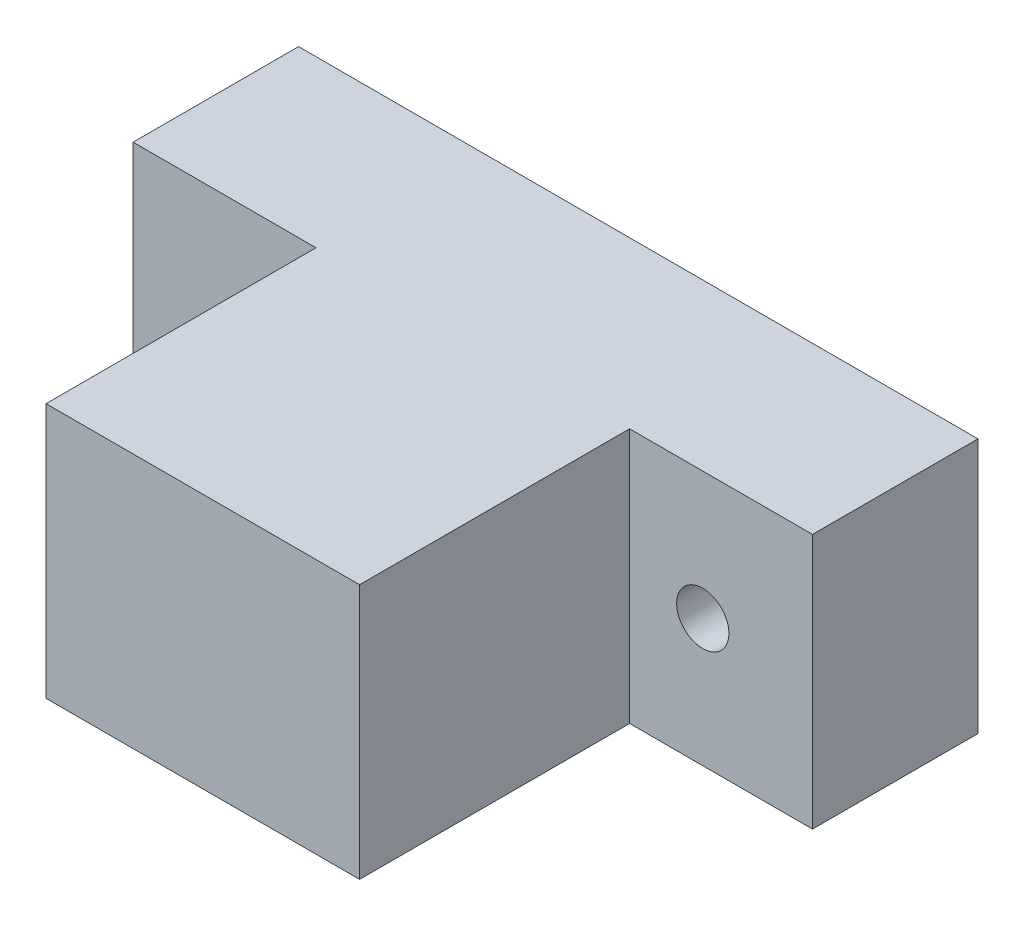
ISO-10303-21;
HEADER;
FILE_DESCRIPTION(('STEP AP214'),'2;1');
FILE_NAME('part.step','',(''),(''),'','','');
FILE_SCHEMA(('AUTOMOTIVE_DESIGN { 1 0 10303 214 1 1 1 1 }'));
ENDSEC;
DATA;
#1=APPLICATION_CONTEXT('core data for automotive mechanical design processes');
#2=APPLICATION_PROTOCOL_DEFINITION('international standard','automotive_design',2000,#1);
#3=PRODUCT_CONTEXT('',#1,'mechanical');
#4=PRODUCT('Part','Part','',(#3));
#5=PRODUCT_RELATED_PRODUCT_CATEGORY('part','',(#4));
#6=PRODUCT_DEFINITION_FORMATION('','',#4);
#7=PRODUCT_DEFINITION_CONTEXT('part definition',#1,'design');
#8=PRODUCT_DEFINITION('design','',#6,#7);
#9=PRODUCT_DEFINITION_SHAPE('','',#8);
#10=(LENGTH_UNIT() NAMED_UNIT(*) SI_UNIT(.MILLI.,.METRE.));
#11=(NAMED_UNIT(*) PLANE_ANGLE_UNIT() SI_UNIT($,.RADIAN.));
#12=(NAMED_UNIT(*) SI_UNIT($,.STERADIAN.) SOLID_ANGLE_UNIT());
#13=UNCERTAINTY_MEASURE_WITH_UNIT(LENGTH_MEASURE(1.E-05),#10,'distance_accuracy_value','');
#14=(GEOMETRIC_REPRESENTATION_CONTEXT(3) GLOBAL_UNCERTAINTY_ASSIGNED_CONTEXT((#13)) GLOBAL_UNIT_ASSIGNED_CONTEXT((#10,
#11,#12)) REPRESENTATION_CONTEXT('',''));
#15=CARTESIAN_POINT('',(0.,0.,0.));
#16=DIRECTION('',(0.,0.,1.));
#17=DIRECTION('',(1.,0.,0.));
#18=AXIS2_PLACEMENT_3D('',#15,#16,#17);
#19=CARTESIAN_POINT('',(0.,0.,9.5));
#20=DIRECTION('',(0.,0.,-1.));
#21=DIRECTION('',(-1.,0.,0.));
#22=AXIS2_PLACEMENT_3D('',#19,#20,#21);
#23=PLANE('',#22);
#24=CARTESIAN_POINT('',(6.3,7.325,9.5));
#25=DIRECTION('',(0.,0.,-1.));
#26=DIRECTION('',(-1.,0.,0.));
#27=AXIS2_PLACEMENT_3D('',#24,#25,#26);
#28=CIRCLE('',#27,1.5);
#29=CARTESIAN_POINT('',(4.8,7.325,9.5));
#30=VERTEX_POINT('',#29);
#31=EDGE_CURVE('E178',#30,#30,#28,.T.);
#32=ORIENTED_EDGE('',*,*,#31,.T.);
#33=EDGE_LOOP('',(#32));
#34=FACE_BOUND('',#33,.T.);
#35=DIRECTION('',(0.,-1.,0.));
#36=VECTOR('',#35,1.);
#37=CARTESIAN_POINT('',(10.5,14.65,9.5));
#38=LINE('',#37,#36);
#39=CARTESIAN_POINT('',(10.5,14.65,9.5));
#40=VERTEX_POINT('',#39);
#41=CARTESIAN_POINT('',(10.5,0.,9.5));
#42=VERTEX_POINT('',#41);
#43=EDGE_CURVE('E48',#40,#42,#38,.T.);
#44=ORIENTED_EDGE('',*,*,#43,.F.);
#45=DIRECTION('',(-1.,0.,0.));
#46=VECTOR('',#45,1.);
#47=CARTESIAN_POINT('',(0.,14.65,9.5));
#48=LINE('',#47,#46);
#49=CARTESIAN_POINT('',(0.,14.65,9.5));
#50=VERTEX_POINT('',#49);
#51=EDGE_CURVE('E137',#40,#50,#48,.T.);
#52=ORIENTED_EDGE('',*,*,#51,.T.);
#53=DIRECTION('',(0.,-1.,0.));
#54=VECTOR('',#53,1.);
#55=CARTESIAN_POINT('',(0.,0.,9.5));
#56=LINE('',#55,#54);
#57=CARTESIAN_POINT('',(0.,0.,9.5));
#58=VERTEX_POINT('',#57);
#59=EDGE_CURVE('E128',#50,#58,#56,.T.);
#60=ORIENTED_EDGE('',*,*,#59,.T.);
#61=DIRECTION('',(1.,0.,0.));
#62=VECTOR('',#61,1.);
#63=CARTESIAN_POINT('',(0.,0.,9.5));
#64=LINE('',#63,#62);
#65=EDGE_CURVE('E133',#58,#42,#64,.T.);
#66=ORIENTED_EDGE('',*,*,#65,.T.);
#67=EDGE_LOOP('',(#44,#52,#60,#66));
#68=FACE_BOUND('',#67,.T.);
#69=ADVANCED_FACE('F33',(#34,#68),#23,.F.);
#70=CARTESIAN_POINT('',(32.7,7.325,9.5));
#71=DIRECTION('',(0.,0.,-1.));
#72=DIRECTION('',(-1.,0.,0.));
#73=AXIS2_PLACEMENT_3D('',#70,#71,#72);
#74=CIRCLE('',#73,1.5);
#75=CARTESIAN_POINT('',(31.2,7.325,9.5));
#76=VERTEX_POINT('',#75);
#77=EDGE_CURVE('E173',#76,#76,#74,.T.);
#78=ORIENTED_EDGE('',*,*,#77,.T.);
#79=EDGE_LOOP('',(#78));
#80=FACE_BOUND('',#79,.T.);
#81=DIRECTION('',(0.,1.,0.));
#82=VECTOR('',#81,1.);
#83=CARTESIAN_POINT('',(28.5,14.65,9.5));
#84=LINE('',#83,#82);
#85=CARTESIAN_POINT('',(28.5,0.,9.5));
#86=VERTEX_POINT('',#85);
#87=CARTESIAN_POINT('',(28.5,14.65,9.5));
#88=VERTEX_POINT('',#87);
#89=EDGE_CURVE('E56',#86,#88,#84,.T.);
#90=ORIENTED_EDGE('',*,*,#89,.F.);
#91=CARTESIAN_POINT('',(39.,0.,9.5));
#92=VERTEX_POINT('',#91);
#93=EDGE_CURVE('E131',#86,#92,#64,.T.);
#94=ORIENTED_EDGE('',*,*,#93,.T.);
#95=DIRECTION('',(0.,1.,0.));
#96=VECTOR('',#95,1.);
#97=CARTESIAN_POINT('',(39.,0.,9.5));
#98=LINE('',#97,#96);
#99=CARTESIAN_POINT('',(39.,14.65,9.5));
#100=VERTEX_POINT('',#99);
#101=EDGE_CURVE('E135',#92,#100,#98,.T.);
#102=ORIENTED_EDGE('',*,*,#101,.T.);
#103=EDGE_CURVE('E138',#100,#88,#48,.T.);
#104=ORIENTED_EDGE('',*,*,#103,.T.);
#105=EDGE_LOOP('',(#90,#94,#102,#104));
#106=FACE_BOUND('',#105,.T.);
#107=ADVANCED_FACE('F203',(#80,#106),#23,.F.);
#108=CARTESIAN_POINT('',(0.,0.,9.5));
#109=DIRECTION('',(1.,0.,0.));
#110=DIRECTION('',(0.,0.,-1.));
#111=AXIS2_PLACEMENT_3D('',#108,#109,#110);
#112=PLANE('',#111);
#113=DIRECTION('',(0.,-1.,0.));
#114=VECTOR('',#113,1.);
#115=CARTESIAN_POINT('',(0.,0.,0.));
#116=LINE('',#115,#114);
#117=CARTESIAN_POINT('',(0.,14.65,0.));
#118=VERTEX_POINT('',#117);
#119=CARTESIAN_POINT('',(0.,0.,0.));
#120=VERTEX_POINT('',#119);
#121=EDGE_CURVE('E119',#118,#120,#116,.T.);
#122=ORIENTED_EDGE('',*,*,#121,.T.);
#123=DIRECTION('',(0.,0.,-1.));
#124=VECTOR('',#123,1.);
#125=CARTESIAN_POINT('',(0.,0.,9.5));
#126=LINE('',#125,#124);
#127=EDGE_CURVE('E11',#58,#120,#126,.T.);
#128=ORIENTED_EDGE('',*,*,#127,.F.);
#129=ORIENTED_EDGE('',*,*,#59,.F.);
#130=DIRECTION('',(0.,0.,-1.));
#131=VECTOR('',#130,1.);
#132=CARTESIAN_POINT('',(0.,14.65,9.5));
#133=LINE('',#132,#131);
#134=EDGE_CURVE('E139',#50,#118,#133,.T.);
#135=ORIENTED_EDGE('',*,*,#134,.T.);
#136=EDGE_LOOP('',(#122,#128,#129,#135));
#137=FACE_BOUND('',#136,.T.);
#138=ADVANCED_FACE('F35',(#137),#112,.F.);
#139=CARTESIAN_POINT('',(0.,0.,9.5));
#140=DIRECTION('',(0.,1.,0.));
#141=DIRECTION('',(0.,0.,1.));
#142=AXIS2_PLACEMENT_3D('',#139,#140,#141);
#143=PLANE('',#142);
#144=DIRECTION('',(1.,0.,0.));
#145=VECTOR('',#144,1.);
#146=CARTESIAN_POINT('',(0.,0.,0.));
#147=LINE('',#146,#145);
#148=CARTESIAN_POINT('',(39.,0.,0.));
#149=VERTEX_POINT('',#148);
#150=EDGE_CURVE('E122',#120,#149,#147,.T.);
#151=ORIENTED_EDGE('',*,*,#150,.T.);
#152=DIRECTION('',(0.,0.,-1.));
#153=VECTOR('',#152,1.);
#154=CARTESIAN_POINT('',(39.,0.,9.5));
#155=LINE('',#154,#153);
#156=EDGE_CURVE('E41',#92,#149,#155,.T.);
#157=ORIENTED_EDGE('',*,*,#156,.F.);
#158=ORIENTED_EDGE('',*,*,#93,.F.);
#159=DIRECTION('',(0.,0.,-1.));
#160=VECTOR('',#159,1.);
#161=CARTESIAN_POINT('',(28.5,0.,25.));
#162=LINE('',#161,#160);
#163=CARTESIAN_POINT('',(28.5,0.,25.));
#164=VERTEX_POINT('',#163);
#165=EDGE_CURVE('E104',#164,#86,#162,.T.);
#166=ORIENTED_EDGE('',*,*,#165,.F.);
#167=DIRECTION('',(1.,0.,0.));
#168=VECTOR('',#167,1.);
#169=CARTESIAN_POINT('',(10.5,0.,25.));
#170=LINE('',#169,#168);
#171=CARTESIAN_POINT('',(10.5,0.,25.));
#172=VERTEX_POINT('',#171);
#173=EDGE_CURVE('E98',#172,#164,#170,.T.);
#174=ORIENTED_EDGE('',*,*,#173,.F.);
#175=DIRECTION('',(0.,0.,-1.));
#176=VECTOR('',#175,1.);
#177=CARTESIAN_POINT('',(10.5,0.,25.));
#178=LINE('',#177,#176);
#179=EDGE_CURVE('E102',#172,#42,#178,.T.);
#180=ORIENTED_EDGE('',*,*,#179,.T.);
#181=ORIENTED_EDGE('',*,*,#65,.F.);
#182=ORIENTED_EDGE('',*,*,#127,.T.);
#183=EDGE_LOOP('',(#151,#157,#158,#166,#174,#180,#181,#182));
#184=FACE_BOUND('',#183,.T.);
#185=ADVANCED_FACE('F100',(#184),#143,.F.);
#186=CARTESIAN_POINT('',(39.,0.,9.5));
#187=DIRECTION('',(-1.,0.,0.));
#188=DIRECTION('',(0.,0.,1.));
#189=AXIS2_PLACEMENT_3D('',#186,#187,#188);
#190=PLANE('',#189);
#191=DIRECTION('',(0.,1.,0.));
#192=VECTOR('',#191,1.);
#193=CARTESIAN_POINT('',(39.,0.,0.));
#194=LINE('',#193,#192);
#195=CARTESIAN_POINT('',(39.,14.65,0.));
#196=VERTEX_POINT('',#195);
#197=EDGE_CURVE('E142',#149,#196,#194,.T.);
#198=ORIENTED_EDGE('',*,*,#197,.T.);
#199=DIRECTION('',(0.,0.,-1.));
#200=VECTOR('',#199,1.);
#201=CARTESIAN_POINT('',(39.,14.65,9.5));
#202=LINE('',#201,#200);
#203=EDGE_CURVE('E147',#100,#196,#202,.T.);
#204=ORIENTED_EDGE('',*,*,#203,.F.);
#205=ORIENTED_EDGE('',*,*,#101,.F.);
#206=ORIENTED_EDGE('',*,*,#156,.T.);
#207=EDGE_LOOP('',(#198,#204,#205,#206));
#208=FACE_BOUND('',#207,.T.);
#209=ADVANCED_FACE('F154',(#208),#190,.F.);
#210=CARTESIAN_POINT('',(0.,14.65,9.5));
#211=DIRECTION('',(0.,-1.,0.));
#212=DIRECTION('',(0.,0.,-1.));
#213=AXIS2_PLACEMENT_3D('',#210,#211,#212);
#214=PLANE('',#213);
#215=DIRECTION('',(-1.,0.,0.));
#216=VECTOR('',#215,1.);
#217=CARTESIAN_POINT('',(0.,14.65,0.));
#218=LINE('',#217,#216);
#219=EDGE_CURVE('E132',#196,#118,#218,.T.);
#220=ORIENTED_EDGE('',*,*,#219,.T.);
#221=ORIENTED_EDGE('',*,*,#134,.F.);
#222=ORIENTED_EDGE('',*,*,#51,.F.);
#223=DIRECTION('',(0.,0.,-1.));
#224=VECTOR('',#223,1.);
#225=CARTESIAN_POINT('',(10.5,14.65,25.));
#226=LINE('',#225,#224);
#227=CARTESIAN_POINT('',(10.5,14.65,25.));
#228=VERTEX_POINT('',#227);
#229=EDGE_CURVE('E167',#228,#40,#226,.T.);
#230=ORIENTED_EDGE('',*,*,#229,.F.);
#231=DIRECTION('',(-1.,0.,0.));
#232=VECTOR('',#231,1.);
#233=CARTESIAN_POINT('',(10.5,14.65,25.));
#234=LINE('',#233,#232);
#235=CARTESIAN_POINT('',(28.5,14.65,25.));
#236=VERTEX_POINT('',#235);
#237=EDGE_CURVE('E113',#236,#228,#234,.T.);
#238=ORIENTED_EDGE('',*,*,#237,.F.);
#239=DIRECTION('',(0.,0.,-1.));
#240=VECTOR('',#239,1.);
#241=CARTESIAN_POINT('',(28.5,14.65,25.));
#242=LINE('',#241,#240);
#243=EDGE_CURVE('E124',#236,#88,#242,.T.);
#244=ORIENTED_EDGE('',*,*,#243,.T.);
#245=ORIENTED_EDGE('',*,*,#103,.F.);
#246=ORIENTED_EDGE('',*,*,#203,.T.);
#247=EDGE_LOOP('',(#220,#221,#222,#230,#238,#244,#245,#246));
#248=FACE_BOUND('',#247,.T.);
#249=ADVANCED_FACE('F162',(#248),#214,.F.);
#250=CARTESIAN_POINT('',(0.,0.,0.));
#251=DIRECTION('',(0.,0.,-1.));
#252=DIRECTION('',(-1.,0.,0.));
#253=AXIS2_PLACEMENT_3D('',#250,#251,#252);
#254=PLANE('',#253);
#255=CARTESIAN_POINT('',(32.7,7.325,0.));
#256=DIRECTION('',(0.,0.,-1.));
#257=DIRECTION('',(-1.,0.,0.));
#258=AXIS2_PLACEMENT_3D('',#255,#256,#257);
#259=CIRCLE('',#258,1.5);
#260=CARTESIAN_POINT('',(31.2,7.325,0.));
#261=VERTEX_POINT('',#260);
#262=EDGE_CURVE('E181',#261,#261,#259,.T.);
#263=ORIENTED_EDGE('',*,*,#262,.F.);
#264=EDGE_LOOP('',(#263));
#265=FACE_BOUND('',#264,.T.);
#266=CARTESIAN_POINT('',(6.3,7.325,0.));
#267=DIRECTION('',(0.,0.,-1.));
#268=DIRECTION('',(1.,0.,0.));
#269=AXIS2_PLACEMENT_3D('',#266,#267,#268);
#270=CIRCLE('',#269,1.5);
#271=CARTESIAN_POINT('',(7.8,7.325,0.));
#272=VERTEX_POINT('',#271);
#273=EDGE_CURVE('E182',#272,#272,#270,.T.);
#274=ORIENTED_EDGE('',*,*,#273,.F.);
#275=EDGE_LOOP('',(#274));
#276=FACE_BOUND('',#275,.T.);
#277=ORIENTED_EDGE('',*,*,#121,.F.);
#278=ORIENTED_EDGE('',*,*,#219,.F.);
#279=ORIENTED_EDGE('',*,*,#197,.F.);
#280=ORIENTED_EDGE('',*,*,#150,.F.);
#281=EDGE_LOOP('',(#277,#278,#279,#280));
#282=FACE_BOUND('',#281,.T.);
#283=ADVANCED_FACE('F159',(#265,#276,#282),#254,.T.);
#284=CARTESIAN_POINT('',(10.5,14.65,25.));
#285=DIRECTION('',(1.,0.,0.));
#286=DIRECTION('',(0.,0.,-1.));
#287=AXIS2_PLACEMENT_3D('',#284,#285,#286);
#288=PLANE('',#287);
#289=ORIENTED_EDGE('',*,*,#43,.T.);
#290=ORIENTED_EDGE('',*,*,#179,.F.);
#291=DIRECTION('',(0.,-1.,0.));
#292=VECTOR('',#291,1.);
#293=CARTESIAN_POINT('',(10.5,14.65,25.));
#294=LINE('',#293,#292);
#295=EDGE_CURVE('E108',#228,#172,#294,.T.);
#296=ORIENTED_EDGE('',*,*,#295,.F.);
#297=ORIENTED_EDGE('',*,*,#229,.T.);
#298=EDGE_LOOP('',(#289,#290,#296,#297));
#299=FACE_BOUND('',#298,.T.);
#300=ADVANCED_FACE('F118',(#299),#288,.F.);
#301=CARTESIAN_POINT('',(28.5,14.65,25.));
#302=DIRECTION('',(-1.,0.,0.));
#303=DIRECTION('',(0.,-1.,0.));
#304=AXIS2_PLACEMENT_3D('',#301,#302,#303);
#305=PLANE('',#304);
#306=ORIENTED_EDGE('',*,*,#89,.T.);
#307=ORIENTED_EDGE('',*,*,#243,.F.);
#308=DIRECTION('',(0.,1.,0.));
#309=VECTOR('',#308,1.);
#310=CARTESIAN_POINT('',(28.5,14.65,25.));
#311=LINE('',#310,#309);
#312=EDGE_CURVE('E107',#164,#236,#311,.T.);
#313=ORIENTED_EDGE('',*,*,#312,.F.);
#314=ORIENTED_EDGE('',*,*,#165,.T.);
#315=EDGE_LOOP('',(#306,#307,#313,#314));
#316=FACE_BOUND('',#315,.T.);
#317=ADVANCED_FACE('F258',(#316),#305,.F.);
#318=CARTESIAN_POINT('',(0.,0.,25.));
#319=DIRECTION('',(0.,0.,1.));
#320=DIRECTION('',(1.,0.,0.));
#321=AXIS2_PLACEMENT_3D('',#318,#319,#320);
#322=PLANE('',#321);
#323=ORIENTED_EDGE('',*,*,#295,.T.);
#324=ORIENTED_EDGE('',*,*,#173,.T.);
#325=ORIENTED_EDGE('',*,*,#312,.T.);
#326=ORIENTED_EDGE('',*,*,#237,.T.);
#327=EDGE_LOOP('',(#323,#324,#325,#326));
#328=FACE_BOUND('',#327,.T.);
#329=ADVANCED_FACE('F111',(#328),#322,.T.);
#330=CARTESIAN_POINT('',(6.3,7.325,15.5));
#331=DIRECTION('',(0.,0.,-1.));
#332=DIRECTION('',(-1.,0.,0.));
#333=AXIS2_PLACEMENT_3D('',#330,#331,#332);
#334=CYLINDRICAL_SURFACE('',#333,1.5);
#335=ORIENTED_EDGE('',*,*,#273,.T.);
#336=EDGE_LOOP('',(#335));
#337=FACE_BOUND('',#336,.T.);
#338=ORIENTED_EDGE('',*,*,#31,.F.);
#339=EDGE_LOOP('',(#338));
#340=FACE_BOUND('',#339,.T.);
#341=ADVANCED_FACE('F196',(#337,#340),#334,.F.);
#342=CARTESIAN_POINT('',(32.7,7.325,15.5));
#343=DIRECTION('',(0.,0.,-1.));
#344=DIRECTION('',(-1.,0.,0.));
#345=AXIS2_PLACEMENT_3D('',#342,#343,#344);
#346=CYLINDRICAL_SURFACE('',#345,1.5);
#347=ORIENTED_EDGE('',*,*,#262,.T.);
#348=EDGE_LOOP('',(#347));
#349=FACE_BOUND('',#348,.T.);
#350=ORIENTED_EDGE('',*,*,#77,.F.);
#351=EDGE_LOOP('',(#350));
#352=FACE_BOUND('',#351,.T.);
#353=ADVANCED_FACE('F188',(#349,#352),#346,.F.);
#354=CLOSED_SHELL('',(#69,#107,#138,#185,#209,#249,#283,#300,#317,#329,#341,#353));
#355=MANIFOLD_SOLID_BREP('B2',#354);
#356=ADVANCED_BREP_SHAPE_REPRESENTATION('',(#18,#355),#14);
#357=SHAPE_DEFINITION_REPRESENTATION(#9,#356);
ENDSEC;
END-ISO-10303-21;
